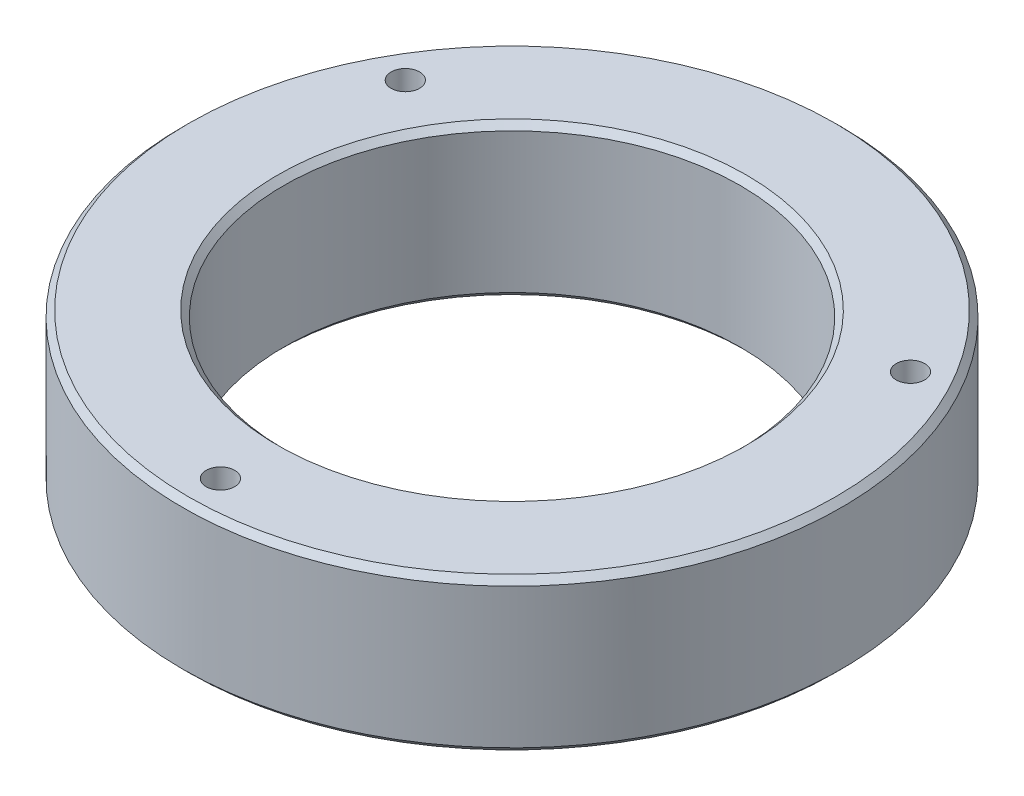
ISO-10303-21;
HEADER;
FILE_DESCRIPTION(('STEP AP214'),'2;1');
FILE_NAME('part.step','',(''),(''),'','','');
FILE_SCHEMA(('AUTOMOTIVE_DESIGN { 1 0 10303 214 1 1 1 1 }'));
ENDSEC;
DATA;
#1=APPLICATION_CONTEXT('core data for automotive mechanical design processes');
#2=APPLICATION_PROTOCOL_DEFINITION('international standard','automotive_design',2000,#1);
#3=PRODUCT_CONTEXT('',#1,'mechanical');
#4=PRODUCT('Part','Part','',(#3));
#5=PRODUCT_RELATED_PRODUCT_CATEGORY('part','',(#4));
#6=PRODUCT_DEFINITION_FORMATION('','',#4);
#7=PRODUCT_DEFINITION_CONTEXT('part definition',#1,'design');
#8=PRODUCT_DEFINITION('design','',#6,#7);
#9=PRODUCT_DEFINITION_SHAPE('','',#8);
#10=(LENGTH_UNIT() NAMED_UNIT(*) SI_UNIT(.MILLI.,.METRE.));
#11=(NAMED_UNIT(*) PLANE_ANGLE_UNIT() SI_UNIT($,.RADIAN.));
#12=(NAMED_UNIT(*) SI_UNIT($,.STERADIAN.) SOLID_ANGLE_UNIT());
#13=UNCERTAINTY_MEASURE_WITH_UNIT(LENGTH_MEASURE(1.E-05),#10,'distance_accuracy_value','');
#14=(GEOMETRIC_REPRESENTATION_CONTEXT(3) GLOBAL_UNCERTAINTY_ASSIGNED_CONTEXT((#13)) GLOBAL_UNIT_ASSIGNED_CONTEXT((#10,
#11,#12)) REPRESENTATION_CONTEXT('',''));
#15=CARTESIAN_POINT('',(0.,0.,0.));
#16=DIRECTION('',(0.,0.,1.));
#17=DIRECTION('',(1.,0.,0.));
#18=AXIS2_PLACEMENT_3D('',#15,#16,#17);
#19=CARTESIAN_POINT('',(-57.15,-19.05,0.));
#20=DIRECTION('',(0.,1.,0.));
#21=DIRECTION('',(0.,0.,1.));
#22=AXIS2_PLACEMENT_3D('',#19,#20,#21);
#23=PLANE('',#22);
#24=CARTESIAN_POINT('',(0.,-19.05,0.));
#25=DIRECTION('',(0.,1.,0.));
#26=DIRECTION('',(0.,0.,1.));
#27=AXIS2_PLACEMENT_3D('',#24,#25,#26);
#28=CIRCLE('',#27,58.674);
#29=CARTESIAN_POINT('',(0.,-19.05,-58.674));
#30=VERTEX_POINT('',#29);
#31=EDGE_CURVE('E55',#30,#30,#28,.T.);
#32=ORIENTED_EDGE('',*,*,#31,.T.);
#33=EDGE_LOOP('',(#32));
#34=FACE_BOUND('',#33,.T.);
#35=CARTESIAN_POINT('',(0.,-19.05,0.));
#36=DIRECTION('',(0.,1.,0.));
#37=DIRECTION('',(0.,0.,1.));
#38=AXIS2_PLACEMENT_3D('',#35,#36,#37);
#39=CIRCLE('',#38,81.0006);
#40=CARTESIAN_POINT('',(0.,-19.05,81.0006));
#41=VERTEX_POINT('',#40);
#42=EDGE_CURVE('E59',#41,#41,#39,.F.);
#43=ORIENTED_EDGE('',*,*,#42,.T.);
#44=EDGE_LOOP('',(#43));
#45=FACE_BOUND('',#44,.T.);
#46=CARTESIAN_POINT('',(-69.85,-19.05,0.));
#47=DIRECTION('',(0.,1.,0.));
#48=DIRECTION('',(0.,0.,1.));
#49=AXIS2_PLACEMENT_3D('',#46,#47,#48);
#50=CIRCLE('',#49,3.96874999999999);
#51=CARTESIAN_POINT('',(-69.85,-19.05,3.96874999999999));
#52=VERTEX_POINT('',#51);
#53=EDGE_CURVE('E119',#52,#52,#50,.T.);
#54=ORIENTED_EDGE('',*,*,#53,.T.);
#55=EDGE_LOOP('',(#54));
#56=FACE_BOUND('',#55,.T.);
#57=CARTESIAN_POINT('',(69.85,-19.05,0.));
#58=DIRECTION('',(0.,1.,0.));
#59=DIRECTION('',(0.,0.,1.));
#60=AXIS2_PLACEMENT_3D('',#57,#58,#59);
#61=CIRCLE('',#60,3.96874999999999);
#62=CARTESIAN_POINT('',(69.85,-19.05,3.96874999999999));
#63=VERTEX_POINT('',#62);
#64=EDGE_CURVE('E113',#63,#63,#61,.T.);
#65=ORIENTED_EDGE('',*,*,#64,.T.);
#66=EDGE_LOOP('',(#65));
#67=FACE_BOUND('',#66,.T.);
#68=CARTESIAN_POINT('',(-63.246,-19.05,-36.5252));
#69=DIRECTION('',(0.,1.,0.));
#70=DIRECTION('',(0.,0.,1.));
#71=AXIS2_PLACEMENT_3D('',#68,#69,#70);
#72=CIRCLE('',#71,5.5626);
#73=CARTESIAN_POINT('',(-63.246,-19.05,-30.9626));
#74=VERTEX_POINT('',#73);
#75=EDGE_CURVE('E107',#74,#74,#72,.T.);
#76=ORIENTED_EDGE('',*,*,#75,.T.);
#77=EDGE_LOOP('',(#76));
#78=FACE_BOUND('',#77,.T.);
#79=CARTESIAN_POINT('',(63.246,-19.05,-36.5252));
#80=DIRECTION('',(0.,1.,0.));
#81=DIRECTION('',(0.,0.,1.));
#82=AXIS2_PLACEMENT_3D('',#79,#80,#81);
#83=CIRCLE('',#82,5.5626);
#84=CARTESIAN_POINT('',(63.246,-19.05,-30.9626));
#85=VERTEX_POINT('',#84);
#86=EDGE_CURVE('E100',#85,#85,#83,.T.);
#87=ORIENTED_EDGE('',*,*,#86,.T.);
#88=EDGE_LOOP('',(#87));
#89=FACE_BOUND('',#88,.T.);
#90=CARTESIAN_POINT('',(0.,-19.05,73.025));
#91=DIRECTION('',(0.,1.,0.));
#92=DIRECTION('',(0.,0.,1.));
#93=AXIS2_PLACEMENT_3D('',#90,#91,#92);
#94=CIRCLE('',#93,5.5626);
#95=CARTESIAN_POINT('',(0.,-19.05,78.5876));
#96=VERTEX_POINT('',#95);
#97=EDGE_CURVE('E93',#96,#96,#94,.T.);
#98=ORIENTED_EDGE('',*,*,#97,.T.);
#99=EDGE_LOOP('',(#98));
#100=FACE_BOUND('',#99,.T.);
#101=ADVANCED_FACE('F43',(#34,#45,#56,#67,#78,#89,#100),#23,.F.);
#102=CARTESIAN_POINT('',(0.,-44.45,0.));
#103=DIRECTION('',(0.,-1.,0.));
#104=DIRECTION('',(0.,0.,-1.));
#105=AXIS2_PLACEMENT_3D('',#102,#103,#104);
#106=CYLINDRICAL_SURFACE('',#105,82.5246);
#107=CARTESIAN_POINT('',(0.,17.526,0.));
#108=DIRECTION('',(0.,-1.,0.));
#109=DIRECTION('',(0.,0.,-1.));
#110=AXIS2_PLACEMENT_3D('',#107,#108,#109);
#111=CIRCLE('',#110,82.5246);
#112=CARTESIAN_POINT('',(0.,17.526,-82.5246));
#113=VERTEX_POINT('',#112);
#114=EDGE_CURVE('E10',#113,#113,#111,.T.);
#115=ORIENTED_EDGE('',*,*,#114,.T.);
#116=EDGE_LOOP('',(#115));
#117=FACE_BOUND('',#116,.T.);
#118=CARTESIAN_POINT('',(0.,-17.526,0.));
#119=DIRECTION('',(0.,1.,0.));
#120=DIRECTION('',(0.,0.,1.));
#121=AXIS2_PLACEMENT_3D('',#118,#119,#120);
#122=CIRCLE('',#121,82.5246);
#123=CARTESIAN_POINT('',(0.,-17.526,82.5246));
#124=VERTEX_POINT('',#123);
#125=EDGE_CURVE('E51',#124,#124,#122,.T.);
#126=ORIENTED_EDGE('',*,*,#125,.T.);
#127=EDGE_LOOP('',(#126));
#128=FACE_BOUND('',#127,.T.);
#129=ADVANCED_FACE('F142',(#117,#128),#106,.T.);
#130=CARTESIAN_POINT('',(-82.5246,19.05,0.));
#131=DIRECTION('',(0.,-1.,0.));
#132=DIRECTION('',(0.,0.,-1.));
#133=AXIS2_PLACEMENT_3D('',#130,#131,#132);
#134=PLANE('',#133);
#135=CARTESIAN_POINT('',(0.,19.05,0.));
#136=DIRECTION('',(0.,-1.,0.));
#137=DIRECTION('',(0.,0.,-1.));
#138=AXIS2_PLACEMENT_3D('',#135,#136,#137);
#139=CIRCLE('',#138,58.674);
#140=CARTESIAN_POINT('',(0.,19.05,-58.674));
#141=VERTEX_POINT('',#140);
#142=EDGE_CURVE('E70',#141,#141,#139,.T.);
#143=ORIENTED_EDGE('',*,*,#142,.T.);
#144=EDGE_LOOP('',(#143));
#145=FACE_BOUND('',#144,.T.);
#146=CARTESIAN_POINT('',(0.,19.05,0.));
#147=DIRECTION('',(0.,-1.,0.));
#148=DIRECTION('',(0.,0.,-1.));
#149=AXIS2_PLACEMENT_3D('',#146,#147,#148);
#150=CIRCLE('',#149,81.0006);
#151=CARTESIAN_POINT('',(0.,19.05,-81.0006));
#152=VERTEX_POINT('',#151);
#153=EDGE_CURVE('E73',#152,#152,#150,.F.);
#154=ORIENTED_EDGE('',*,*,#153,.T.);
#155=EDGE_LOOP('',(#154));
#156=FACE_BOUND('',#155,.T.);
#157=CARTESIAN_POINT('',(-63.246,19.05,-36.5252));
#158=DIRECTION('',(0.,1.,0.));
#159=DIRECTION('',(0.,0.,1.));
#160=AXIS2_PLACEMENT_3D('',#157,#158,#159);
#161=CIRCLE('',#160,3.56869999999999);
#162=CARTESIAN_POINT('',(-63.246,19.05,-40.0939));
#163=VERTEX_POINT('',#162);
#164=EDGE_CURVE('E80',#163,#163,#161,.T.);
#165=ORIENTED_EDGE('',*,*,#164,.F.);
#166=EDGE_LOOP('',(#165));
#167=FACE_BOUND('',#166,.T.);
#168=CARTESIAN_POINT('',(63.246,19.05,-36.5252));
#169=DIRECTION('',(0.,1.,0.));
#170=DIRECTION('',(0.,0.,1.));
#171=AXIS2_PLACEMENT_3D('',#168,#169,#170);
#172=CIRCLE('',#171,3.5687);
#173=CARTESIAN_POINT('',(63.246,19.05,-40.0939));
#174=VERTEX_POINT('',#173);
#175=EDGE_CURVE('E85',#174,#174,#172,.T.);
#176=ORIENTED_EDGE('',*,*,#175,.F.);
#177=EDGE_LOOP('',(#176));
#178=FACE_BOUND('',#177,.T.);
#179=CARTESIAN_POINT('',(0.,19.05,73.025));
#180=DIRECTION('',(0.,1.,0.));
#181=DIRECTION('',(0.,0.,1.));
#182=AXIS2_PLACEMENT_3D('',#179,#180,#181);
#183=CIRCLE('',#182,3.5687);
#184=CARTESIAN_POINT('',(0.,19.05,69.4563));
#185=VERTEX_POINT('',#184);
#186=EDGE_CURVE('E76',#185,#185,#183,.T.);
#187=ORIENTED_EDGE('',*,*,#186,.F.);
#188=EDGE_LOOP('',(#187));
#189=FACE_BOUND('',#188,.T.);
#190=ADVANCED_FACE('F148',(#145,#156,#167,#178,#189),#134,.F.);
#191=CARTESIAN_POINT('',(0.,-44.45,0.));
#192=DIRECTION('',(0.,-1.,0.));
#193=DIRECTION('',(0.,0.,-1.));
#194=AXIS2_PLACEMENT_3D('',#191,#192,#193);
#195=CYLINDRICAL_SURFACE('',#194,57.15);
#196=CARTESIAN_POINT('',(0.,17.526,0.));
#197=DIRECTION('',(0.,-1.,0.));
#198=DIRECTION('',(0.,0.,-1.));
#199=AXIS2_PLACEMENT_3D('',#196,#197,#198);
#200=CIRCLE('',#199,57.15);
#201=CARTESIAN_POINT('',(0.,17.526,-57.15));
#202=VERTEX_POINT('',#201);
#203=EDGE_CURVE('E64',#202,#202,#200,.F.);
#204=CARTESIAN_POINT('',(0.,-17.526,0.));
#205=DIRECTION('',(0.,1.,0.));
#206=DIRECTION('',(0.,0.,1.));
#207=AXIS2_PLACEMENT_3D('',#204,#205,#206);
#208=CIRCLE('',#207,57.15);
#209=CARTESIAN_POINT('',(0.,-17.526,-57.15));
#210=VERTEX_POINT('',#209);
#211=EDGE_CURVE('E67',#210,#210,#208,.F.);
#212=CARTESIAN_POINT('',(0.,17.526,-57.15));
#213=CARTESIAN_POINT('',(0.,17.160875,-57.15));
#214=CARTESIAN_POINT('',(0.,16.79575,-57.15));
#215=CARTESIAN_POINT('',(0.,16.0655,-57.15));
#216=CARTESIAN_POINT('',(0.,15.700375,-57.15));
#217=CARTESIAN_POINT('',(0.,14.970125,-57.15));
#218=CARTESIAN_POINT('',(0.,14.605,-57.15));
#219=CARTESIAN_POINT('',(0.,13.87475,-57.15));
#220=CARTESIAN_POINT('',(0.,13.509625,-57.15));
#221=CARTESIAN_POINT('',(0.,12.779375,-57.15));
#222=CARTESIAN_POINT('',(0.,12.41425,-57.15));
#223=CARTESIAN_POINT('',(0.,11.684,-57.15));
#224=CARTESIAN_POINT('',(0.,11.318875,-57.15));
#225=CARTESIAN_POINT('',(0.,10.588625,-57.15));
#226=CARTESIAN_POINT('',(0.,10.2235,-57.15));
#227=CARTESIAN_POINT('',(0.,9.49324999999998,-57.15));
#228=CARTESIAN_POINT('',(0.,9.12812499999998,-57.15));
#229=CARTESIAN_POINT('',(0.,8.39787499999998,-57.15));
#230=CARTESIAN_POINT('',(0.,8.03274999999998,-57.15));
#231=CARTESIAN_POINT('',(0.,7.30249999999998,-57.15));
#232=CARTESIAN_POINT('',(0.,6.93737499999998,-57.15));
#233=CARTESIAN_POINT('',(0.,6.20712499999998,-57.15));
#234=CARTESIAN_POINT('',(0.,5.84199999999998,-57.15));
#235=CARTESIAN_POINT('',(0.,5.11174999999998,-57.15));
#236=CARTESIAN_POINT('',(0.,4.74662499999998,-57.15));
#237=CARTESIAN_POINT('',(0.,4.01637499999998,-57.15));
#238=CARTESIAN_POINT('',(0.,3.65124999999998,-57.15));
#239=CARTESIAN_POINT('',(0.,2.92099999999998,-57.15));
#240=CARTESIAN_POINT('',(0.,2.55587499999998,-57.15));
#241=CARTESIAN_POINT('',(0.,1.82562499999998,-57.15));
#242=CARTESIAN_POINT('',(0.,1.46049999999998,-57.15));
#243=CARTESIAN_POINT('',(0.,0.730249999999976,-57.15));
#244=CARTESIAN_POINT('',(0.,0.365124999999978,-57.15));
#245=CARTESIAN_POINT('',(0.,-0.365125000000019,-57.15));
#246=CARTESIAN_POINT('',(0.,-0.730250000000018,-57.15));
#247=CARTESIAN_POINT('',(0.,-1.46050000000002,-57.15));
#248=CARTESIAN_POINT('',(0.,-1.82562500000002,-57.15));
#249=CARTESIAN_POINT('',(0.,-2.55587500000002,-57.15));
#250=CARTESIAN_POINT('',(0.,-2.92100000000002,-57.15));
#251=CARTESIAN_POINT('',(0.,-3.65125000000002,-57.15));
#252=CARTESIAN_POINT('',(0.,-4.01637500000002,-57.15));
#253=CARTESIAN_POINT('',(0.,-4.74662500000002,-57.15));
#254=CARTESIAN_POINT('',(0.,-5.11175000000002,-57.15));
#255=CARTESIAN_POINT('',(0.,-5.84200000000002,-57.15));
#256=CARTESIAN_POINT('',(0.,-6.20712500000002,-57.15));
#257=CARTESIAN_POINT('',(0.,-6.93737500000002,-57.15));
#258=CARTESIAN_POINT('',(0.,-7.30250000000002,-57.15));
#259=CARTESIAN_POINT('',(0.,-8.03275000000002,-57.15));
#260=CARTESIAN_POINT('',(0.,-8.39787500000002,-57.15));
#261=CARTESIAN_POINT('',(0.,-9.12812500000002,-57.15));
#262=CARTESIAN_POINT('',(0.,-9.49325000000002,-57.15));
#263=CARTESIAN_POINT('',(0.,-10.2235,-57.15));
#264=CARTESIAN_POINT('',(0.,-10.588625,-57.15));
#265=CARTESIAN_POINT('',(0.,-11.318875,-57.15));
#266=CARTESIAN_POINT('',(0.,-11.684,-57.15));
#267=CARTESIAN_POINT('',(0.,-12.41425,-57.15));
#268=CARTESIAN_POINT('',(0.,-12.779375,-57.15));
#269=CARTESIAN_POINT('',(0.,-13.509625,-57.15));
#270=CARTESIAN_POINT('',(0.,-13.87475,-57.15));
#271=CARTESIAN_POINT('',(0.,-14.605,-57.15));
#272=CARTESIAN_POINT('',(0.,-14.970125,-57.15));
#273=CARTESIAN_POINT('',(0.,-15.700375,-57.15));
#274=CARTESIAN_POINT('',(0.,-16.0655,-57.15));
#275=CARTESIAN_POINT('',(0.,-16.79575,-57.15));
#276=CARTESIAN_POINT('',(0.,-17.160875,-57.15));
#277=CARTESIAN_POINT('',(0.,-17.526,-57.15));
#278=B_SPLINE_CURVE_WITH_KNOTS('',3,(#212,#213,#214,#215,#216,#217,#218,#219,#220,#221,#222,
#223,#224,#225,#226,#227,#228,#229,#230,#231,#232,#233,#234,#235,#236,#237,#238,#239,#240,#241,
#242,#243,#244,#245,#246,#247,#248,#249,#250,#251,#252,#253,#254,#255,#256,#257,#258,#259,#260,
#261,#262,#263,#264,#265,#266,#267,#268,#269,#270,#271,#272,#273,#274,#275,#276,#277),
.UNSPECIFIED.,.F.,.F.,(4,2,2,2,2,2,2,2,2,2,2,2,2,2,2,2,2,2,2,2,2,2,2,2,2,2,2,2,2,2,2,2,4),(0.,
1.095375,2.19075,3.286125,4.3815,5.476875,6.57225,7.667625,8.763,9.858375,10.95375,12.049125,
13.1445,14.239875,15.33525,16.430625,17.526,18.621375,19.71675,20.812125,21.9075,23.002875,
24.09825,25.193625,26.289,27.384375,28.47975,29.575125,30.6705,31.765875,32.86125,33.956625,
35.052),.UNSPECIFIED.);
#279=EDGE_CURVE('BSEAM176',#202,#210,#278,.T.);
#280=ORIENTED_EDGE('',*,*,#203,.T.);
#281=ORIENTED_EDGE('',*,*,#211,.T.);
#282=ORIENTED_EDGE('',*,*,#279,.T.);
#283=ORIENTED_EDGE('',*,*,#279,.F.);
#284=EDGE_LOOP('',(#280,#282,#281,#283));
#285=FACE_BOUND('',#284,.T.);
#286=ADVANCED_FACE('F176',(#285),#195,.F.);
#287=CARTESIAN_POINT('',(0.,19.05,73.025));
#288=DIRECTION('',(0.,-1.,0.));
#289=DIRECTION('',(0.,0.,-1.));
#290=AXIS2_PLACEMENT_3D('',#287,#288,#289);
#291=CYLINDRICAL_SURFACE('',#290,3.5687);
#292=CARTESIAN_POINT('',(0.,-9.398,73.025));
#293=DIRECTION('',(0.,1.,0.));
#294=DIRECTION('',(0.,0.,1.));
#295=AXIS2_PLACEMENT_3D('',#292,#293,#294);
#296=CIRCLE('',#295,3.5687);
#297=CARTESIAN_POINT('',(0.,-9.398,69.4563));
#298=VERTEX_POINT('',#297);
#299=EDGE_CURVE('E87',#298,#298,#296,.T.);
#300=CARTESIAN_POINT('',(0.,-9.398,69.4563));
#301=CARTESIAN_POINT('',(0.,-9.10166666666667,69.4563));
#302=CARTESIAN_POINT('',(0.,-8.80533333333333,69.4563));
#303=CARTESIAN_POINT('',(0.,-8.21266666666667,69.4563));
#304=CARTESIAN_POINT('',(0.,-7.91633333333333,69.4563));
#305=CARTESIAN_POINT('',(0.,-7.32366666666667,69.4563));
#306=CARTESIAN_POINT('',(0.,-7.02733333333333,69.4563));
#307=CARTESIAN_POINT('',(0.,-6.43466666666667,69.4563));
#308=CARTESIAN_POINT('',(0.,-6.13833333333333,69.4563));
#309=CARTESIAN_POINT('',(0.,-5.54566666666667,69.4563));
#310=CARTESIAN_POINT('',(0.,-5.24933333333333,69.4563));
#311=CARTESIAN_POINT('',(0.,-4.65666666666667,69.4563));
#312=CARTESIAN_POINT('',(0.,-4.36033333333333,69.4563));
#313=CARTESIAN_POINT('',(0.,-3.76766666666667,69.4563));
#314=CARTESIAN_POINT('',(0.,-3.47133333333333,69.4563));
#315=CARTESIAN_POINT('',(0.,-2.87866666666667,69.4563));
#316=CARTESIAN_POINT('',(0.,-2.58233333333333,69.4563));
#317=CARTESIAN_POINT('',(0.,-1.98966666666667,69.4563));
#318=CARTESIAN_POINT('',(0.,-1.69333333333333,69.4563));
#319=CARTESIAN_POINT('',(0.,-1.10066666666667,69.4563));
#320=CARTESIAN_POINT('',(0.,-0.804333333333332,69.4563));
#321=CARTESIAN_POINT('',(0.,-0.211666666666664,69.4563));
#322=CARTESIAN_POINT('',(0.,0.0846666666666693,69.4563));
#323=CARTESIAN_POINT('',(0.,0.677333333333336,69.4563));
#324=CARTESIAN_POINT('',(0.,0.97366666666667,69.4563));
#325=CARTESIAN_POINT('',(0.,1.56633333333334,69.4563));
#326=CARTESIAN_POINT('',(0.,1.86266666666667,69.4563));
#327=CARTESIAN_POINT('',(0.,2.45533333333334,69.4563));
#328=CARTESIAN_POINT('',(0.,2.75166666666667,69.4563));
#329=CARTESIAN_POINT('',(0.,3.34433333333333,69.4563));
#330=CARTESIAN_POINT('',(0.,3.64066666666667,69.4563));
#331=CARTESIAN_POINT('',(0.,4.23333333333333,69.4563));
#332=CARTESIAN_POINT('',(0.,4.52966666666667,69.4563));
#333=CARTESIAN_POINT('',(0.,5.12233333333333,69.4563));
#334=CARTESIAN_POINT('',(0.,5.41866666666667,69.4563));
#335=CARTESIAN_POINT('',(0.,6.01133333333333,69.4563));
#336=CARTESIAN_POINT('',(0.,6.30766666666667,69.4563));
#337=CARTESIAN_POINT('',(0.,6.90033333333333,69.4563));
#338=CARTESIAN_POINT('',(0.,7.19666666666667,69.4563));
#339=CARTESIAN_POINT('',(0.,7.78933333333333,69.4563));
#340=CARTESIAN_POINT('',(0.,8.08566666666667,69.4563));
#341=CARTESIAN_POINT('',(0.,8.67833333333333,69.4563));
#342=CARTESIAN_POINT('',(0.,8.97466666666667,69.4563));
#343=CARTESIAN_POINT('',(0.,9.56733333333333,69.4563));
#344=CARTESIAN_POINT('',(0.,9.86366666666667,69.4563));
#345=CARTESIAN_POINT('',(0.,10.4563333333333,69.4563));
#346=CARTESIAN_POINT('',(0.,10.7526666666667,69.4563));
#347=CARTESIAN_POINT('',(0.,11.3453333333333,69.4563));
#348=CARTESIAN_POINT('',(0.,11.6416666666667,69.4563));
#349=CARTESIAN_POINT('',(0.,12.2343333333333,69.4563));
#350=CARTESIAN_POINT('',(0.,12.5306666666667,69.4563));
#351=CARTESIAN_POINT('',(0.,13.1233333333333,69.4563));
#352=CARTESIAN_POINT('',(0.,13.4196666666667,69.4563));
#353=CARTESIAN_POINT('',(0.,14.0123333333333,69.4563));
#354=CARTESIAN_POINT('',(0.,14.3086666666667,69.4563));
#355=CARTESIAN_POINT('',(0.,14.9013333333333,69.4563));
#356=CARTESIAN_POINT('',(0.,15.1976666666667,69.4563));
#357=CARTESIAN_POINT('',(0.,15.7903333333333,69.4563));
#358=CARTESIAN_POINT('',(0.,16.0866666666667,69.4563));
#359=CARTESIAN_POINT('',(0.,16.6793333333333,69.4563));
#360=CARTESIAN_POINT('',(0.,16.9756666666667,69.4563));
#361=CARTESIAN_POINT('',(0.,17.5683333333333,69.4563));
#362=CARTESIAN_POINT('',(0.,17.8646666666667,69.4563));
#363=CARTESIAN_POINT('',(0.,18.4573333333333,69.4563));
#364=CARTESIAN_POINT('',(0.,18.7536666666667,69.4563));
#365=CARTESIAN_POINT('',(0.,19.05,69.4563));
#366=B_SPLINE_CURVE_WITH_KNOTS('',3,(#300,#301,#302,#303,#304,#305,#306,#307,#308,#309,#310,
#311,#312,#313,#314,#315,#316,#317,#318,#319,#320,#321,#322,#323,#324,#325,#326,#327,#328,#329,
#330,#331,#332,#333,#334,#335,#336,#337,#338,#339,#340,#341,#342,#343,#344,#345,#346,#347,#348,
#349,#350,#351,#352,#353,#354,#355,#356,#357,#358,#359,#360,#361,#362,#363,#364,#365),
.UNSPECIFIED.,.F.,.F.,(4,2,2,2,2,2,2,2,2,2,2,2,2,2,2,2,2,2,2,2,2,2,2,2,2,2,2,2,2,2,2,2,4),(0.,
0.889000000000001,1.778,2.667,3.556,4.445,5.334,6.223,7.112,8.001,8.89,9.779,10.668,11.557,
12.446,13.335,14.224,15.113,16.002,16.891,17.78,18.669,19.558,20.447,21.336,22.225,23.114,
24.003,24.892,25.781,26.67,27.559,28.448),.UNSPECIFIED.);
#367=EDGE_CURVE('BSEAM184',#298,#185,#366,.T.);
#368=ORIENTED_EDGE('',*,*,#299,.F.);
#369=ORIENTED_EDGE('',*,*,#186,.T.);
#370=ORIENTED_EDGE('',*,*,#367,.T.);
#371=ORIENTED_EDGE('',*,*,#367,.F.);
#372=EDGE_LOOP('',(#368,#370,#369,#371));
#373=FACE_BOUND('',#372,.T.);
#374=ADVANCED_FACE('F184',(#373),#291,.F.);
#375=CARTESIAN_POINT('',(0.,-9.398,73.025));
#376=DIRECTION('',(0.,-1.,0.));
#377=DIRECTION('',(0.,0.,-1.));
#378=AXIS2_PLACEMENT_3D('',#375,#376,#377);
#379=CYLINDRICAL_SURFACE('',#378,5.5626);
#380=CARTESIAN_POINT('',(0.,-9.398,73.025));
#381=DIRECTION('',(0.,1.,0.));
#382=DIRECTION('',(0.,0.,1.));
#383=AXIS2_PLACEMENT_3D('',#380,#381,#382);
#384=CIRCLE('',#383,5.5626);
#385=CARTESIAN_POINT('',(0.,-9.398,78.5876));
#386=VERTEX_POINT('',#385);
#387=EDGE_CURVE('E90',#386,#386,#384,.T.);
#388=ORIENTED_EDGE('',*,*,#387,.T.);
#389=EDGE_LOOP('',(#388));
#390=FACE_BOUND('',#389,.T.);
#391=ORIENTED_EDGE('',*,*,#97,.F.);
#392=EDGE_LOOP('',(#391));
#393=FACE_BOUND('',#392,.T.);
#394=ADVANCED_FACE('F186',(#390,#393),#379,.F.);
#395=CARTESIAN_POINT('',(0.,-9.398,73.025));
#396=DIRECTION('',(0.,1.,0.));
#397=DIRECTION('',(0.,0.,1.));
#398=AXIS2_PLACEMENT_3D('',#395,#396,#397);
#399=PLANE('',#398);
#400=ORIENTED_EDGE('',*,*,#299,.T.);
#401=EDGE_LOOP('',(#400));
#402=FACE_BOUND('',#401,.T.);
#403=ORIENTED_EDGE('',*,*,#387,.F.);
#404=EDGE_LOOP('',(#403));
#405=FACE_BOUND('',#404,.T.);
#406=ADVANCED_FACE('F192',(#402,#405),#399,.F.);
#407=CARTESIAN_POINT('',(63.246,19.05,-36.5252));
#408=DIRECTION('',(0.,-1.,0.));
#409=DIRECTION('',(0.,0.,-1.));
#410=AXIS2_PLACEMENT_3D('',#407,#408,#409);
#411=CYLINDRICAL_SURFACE('',#410,3.5687);
#412=CARTESIAN_POINT('',(63.246,-9.398,-36.5252));
#413=DIRECTION('',(0.,1.,0.));
#414=DIRECTION('',(0.,0.,1.));
#415=AXIS2_PLACEMENT_3D('',#412,#413,#414);
#416=CIRCLE('',#415,3.5687);
#417=CARTESIAN_POINT('',(63.246,-9.398,-40.0939));
#418=VERTEX_POINT('',#417);
#419=EDGE_CURVE('E82',#418,#418,#416,.T.);
#420=CARTESIAN_POINT('',(63.246,-9.398,-40.0939));
#421=CARTESIAN_POINT('',(63.246,-9.10166666666667,-40.0939));
#422=CARTESIAN_POINT('',(63.246,-8.80533333333333,-40.0939));
#423=CARTESIAN_POINT('',(63.246,-8.21266666666667,-40.0939));
#424=CARTESIAN_POINT('',(63.246,-7.91633333333333,-40.0939));
#425=CARTESIAN_POINT('',(63.246,-7.32366666666667,-40.0939));
#426=CARTESIAN_POINT('',(63.246,-7.02733333333333,-40.0939));
#427=CARTESIAN_POINT('',(63.246,-6.43466666666667,-40.0939));
#428=CARTESIAN_POINT('',(63.246,-6.13833333333333,-40.0939));
#429=CARTESIAN_POINT('',(63.246,-5.54566666666667,-40.0939));
#430=CARTESIAN_POINT('',(63.246,-5.24933333333333,-40.0939));
#431=CARTESIAN_POINT('',(63.246,-4.65666666666667,-40.0939));
#432=CARTESIAN_POINT('',(63.246,-4.36033333333333,-40.0939));
#433=CARTESIAN_POINT('',(63.246,-3.76766666666667,-40.0939));
#434=CARTESIAN_POINT('',(63.246,-3.47133333333333,-40.0939));
#435=CARTESIAN_POINT('',(63.246,-2.87866666666667,-40.0939));
#436=CARTESIAN_POINT('',(63.246,-2.58233333333333,-40.0939));
#437=CARTESIAN_POINT('',(63.246,-1.98966666666667,-40.0939));
#438=CARTESIAN_POINT('',(63.246,-1.69333333333333,-40.0939));
#439=CARTESIAN_POINT('',(63.246,-1.10066666666667,-40.0939));
#440=CARTESIAN_POINT('',(63.246,-0.804333333333332,-40.0939));
#441=CARTESIAN_POINT('',(63.246,-0.211666666666664,-40.0939));
#442=CARTESIAN_POINT('',(63.246,0.0846666666666693,-40.0939));
#443=CARTESIAN_POINT('',(63.246,0.677333333333336,-40.0939));
#444=CARTESIAN_POINT('',(63.246,0.97366666666667,-40.0939));
#445=CARTESIAN_POINT('',(63.246,1.56633333333334,-40.0939));
#446=CARTESIAN_POINT('',(63.246,1.86266666666667,-40.0939));
#447=CARTESIAN_POINT('',(63.246,2.45533333333334,-40.0939));
#448=CARTESIAN_POINT('',(63.246,2.75166666666667,-40.0939));
#449=CARTESIAN_POINT('',(63.246,3.34433333333333,-40.0939));
#450=CARTESIAN_POINT('',(63.246,3.64066666666667,-40.0939));
#451=CARTESIAN_POINT('',(63.246,4.23333333333333,-40.0939));
#452=CARTESIAN_POINT('',(63.246,4.52966666666667,-40.0939));
#453=CARTESIAN_POINT('',(63.246,5.12233333333333,-40.0939));
#454=CARTESIAN_POINT('',(63.246,5.41866666666667,-40.0939));
#455=CARTESIAN_POINT('',(63.246,6.01133333333333,-40.0939));
#456=CARTESIAN_POINT('',(63.246,6.30766666666667,-40.0939));
#457=CARTESIAN_POINT('',(63.246,6.90033333333333,-40.0939));
#458=CARTESIAN_POINT('',(63.246,7.19666666666667,-40.0939));
#459=CARTESIAN_POINT('',(63.246,7.78933333333333,-40.0939));
#460=CARTESIAN_POINT('',(63.246,8.08566666666667,-40.0939));
#461=CARTESIAN_POINT('',(63.246,8.67833333333333,-40.0939));
#462=CARTESIAN_POINT('',(63.246,8.97466666666667,-40.0939));
#463=CARTESIAN_POINT('',(63.246,9.56733333333333,-40.0939));
#464=CARTESIAN_POINT('',(63.246,9.86366666666667,-40.0939));
#465=CARTESIAN_POINT('',(63.246,10.4563333333333,-40.0939));
#466=CARTESIAN_POINT('',(63.246,10.7526666666667,-40.0939));
#467=CARTESIAN_POINT('',(63.246,11.3453333333333,-40.0939));
#468=CARTESIAN_POINT('',(63.246,11.6416666666667,-40.0939));
#469=CARTESIAN_POINT('',(63.246,12.2343333333333,-40.0939));
#470=CARTESIAN_POINT('',(63.246,12.5306666666667,-40.0939));
#471=CARTESIAN_POINT('',(63.246,13.1233333333333,-40.0939));
#472=CARTESIAN_POINT('',(63.246,13.4196666666667,-40.0939));
#473=CARTESIAN_POINT('',(63.246,14.0123333333333,-40.0939));
#474=CARTESIAN_POINT('',(63.246,14.3086666666667,-40.0939));
#475=CARTESIAN_POINT('',(63.246,14.9013333333333,-40.0939));
#476=CARTESIAN_POINT('',(63.246,15.1976666666667,-40.0939));
#477=CARTESIAN_POINT('',(63.246,15.7903333333333,-40.0939));
#478=CARTESIAN_POINT('',(63.246,16.0866666666667,-40.0939));
#479=CARTESIAN_POINT('',(63.246,16.6793333333333,-40.0939));
#480=CARTESIAN_POINT('',(63.246,16.9756666666667,-40.0939));
#481=CARTESIAN_POINT('',(63.246,17.5683333333333,-40.0939));
#482=CARTESIAN_POINT('',(63.246,17.8646666666667,-40.0939));
#483=CARTESIAN_POINT('',(63.246,18.4573333333333,-40.0939));
#484=CARTESIAN_POINT('',(63.246,18.7536666666667,-40.0939));
#485=CARTESIAN_POINT('',(63.246,19.05,-40.0939));
#486=B_SPLINE_CURVE_WITH_KNOTS('',3,(#420,#421,#422,#423,#424,#425,#426,#427,#428,#429,#430,
#431,#432,#433,#434,#435,#436,#437,#438,#439,#440,#441,#442,#443,#444,#445,#446,#447,#448,#449,
#450,#451,#452,#453,#454,#455,#456,#457,#458,#459,#460,#461,#462,#463,#464,#465,#466,#467,#468,
#469,#470,#471,#472,#473,#474,#475,#476,#477,#478,#479,#480,#481,#482,#483,#484,#485),
.UNSPECIFIED.,.F.,.F.,(4,2,2,2,2,2,2,2,2,2,2,2,2,2,2,2,2,2,2,2,2,2,2,2,2,2,2,2,2,2,2,2,4),(0.,
0.889000000000001,1.778,2.667,3.556,4.445,5.334,6.223,7.112,8.001,8.89,9.779,10.668,11.557,
12.446,13.335,14.224,15.113,16.002,16.891,17.78,18.669,19.558,20.447,21.336,22.225,23.114,
24.003,24.892,25.781,26.67,27.559,28.448),.UNSPECIFIED.);
#487=EDGE_CURVE('BSEAM202',#418,#174,#486,.T.);
#488=ORIENTED_EDGE('',*,*,#419,.F.);
#489=ORIENTED_EDGE('',*,*,#175,.T.);
#490=ORIENTED_EDGE('',*,*,#487,.T.);
#491=ORIENTED_EDGE('',*,*,#487,.F.);
#492=EDGE_LOOP('',(#488,#490,#489,#491));
#493=FACE_BOUND('',#492,.T.);
#494=ADVANCED_FACE('F202',(#493),#411,.F.);
#495=CARTESIAN_POINT('',(63.246,-9.398,-36.5252));
#496=DIRECTION('',(0.,-1.,0.));
#497=DIRECTION('',(0.,0.,-1.));
#498=AXIS2_PLACEMENT_3D('',#495,#496,#497);
#499=CYLINDRICAL_SURFACE('',#498,5.5626);
#500=CARTESIAN_POINT('',(63.246,-9.398,-36.5252));
#501=DIRECTION('',(0.,1.,0.));
#502=DIRECTION('',(0.,0.,1.));
#503=AXIS2_PLACEMENT_3D('',#500,#501,#502);
#504=CIRCLE('',#503,5.5626);
#505=CARTESIAN_POINT('',(63.246,-9.398,-30.9626));
#506=VERTEX_POINT('',#505);
#507=EDGE_CURVE('E86',#506,#506,#504,.T.);
#508=ORIENTED_EDGE('',*,*,#507,.T.);
#509=EDGE_LOOP('',(#508));
#510=FACE_BOUND('',#509,.T.);
#511=ORIENTED_EDGE('',*,*,#86,.F.);
#512=EDGE_LOOP('',(#511));
#513=FACE_BOUND('',#512,.T.);
#514=ADVANCED_FACE('F206',(#510,#513),#499,.F.);
#515=CARTESIAN_POINT('',(63.246,-9.398,-36.5252));
#516=DIRECTION('',(0.,1.,0.));
#517=DIRECTION('',(0.,0.,1.));
#518=AXIS2_PLACEMENT_3D('',#515,#516,#517);
#519=PLANE('',#518);
#520=ORIENTED_EDGE('',*,*,#419,.T.);
#521=EDGE_LOOP('',(#520));
#522=FACE_BOUND('',#521,.T.);
#523=ORIENTED_EDGE('',*,*,#507,.F.);
#524=EDGE_LOOP('',(#523));
#525=FACE_BOUND('',#524,.T.);
#526=ADVANCED_FACE('F210',(#522,#525),#519,.F.);
#527=CARTESIAN_POINT('',(-63.246,19.05,-36.5252));
#528=DIRECTION('',(0.,-1.,0.));
#529=DIRECTION('',(0.,0.,-1.));
#530=AXIS2_PLACEMENT_3D('',#527,#528,#529);
#531=CYLINDRICAL_SURFACE('',#530,3.56869999999999);
#532=CARTESIAN_POINT('',(-63.246,-9.398,-36.5252));
#533=DIRECTION('',(0.,1.,0.));
#534=DIRECTION('',(0.,0.,1.));
#535=AXIS2_PLACEMENT_3D('',#532,#533,#534);
#536=CIRCLE('',#535,3.56869999999999);
#537=CARTESIAN_POINT('',(-63.246,-9.398,-40.0939));
#538=VERTEX_POINT('',#537);
#539=EDGE_CURVE('E77',#538,#538,#536,.T.);
#540=CARTESIAN_POINT('',(-63.246,-9.398,-40.0939));
#541=CARTESIAN_POINT('',(-63.246,-9.10166666666667,-40.0939));
#542=CARTESIAN_POINT('',(-63.246,-8.80533333333333,-40.0939));
#543=CARTESIAN_POINT('',(-63.246,-8.21266666666667,-40.0939));
#544=CARTESIAN_POINT('',(-63.246,-7.91633333333333,-40.0939));
#545=CARTESIAN_POINT('',(-63.246,-7.32366666666667,-40.0939));
#546=CARTESIAN_POINT('',(-63.246,-7.02733333333333,-40.0939));
#547=CARTESIAN_POINT('',(-63.246,-6.43466666666667,-40.0939));
#548=CARTESIAN_POINT('',(-63.246,-6.13833333333333,-40.0939));
#549=CARTESIAN_POINT('',(-63.246,-5.54566666666667,-40.0939));
#550=CARTESIAN_POINT('',(-63.246,-5.24933333333333,-40.0939));
#551=CARTESIAN_POINT('',(-63.246,-4.65666666666667,-40.0939));
#552=CARTESIAN_POINT('',(-63.246,-4.36033333333333,-40.0939));
#553=CARTESIAN_POINT('',(-63.246,-3.76766666666667,-40.0939));
#554=CARTESIAN_POINT('',(-63.246,-3.47133333333333,-40.0939));
#555=CARTESIAN_POINT('',(-63.246,-2.87866666666667,-40.0939));
#556=CARTESIAN_POINT('',(-63.246,-2.58233333333333,-40.0939));
#557=CARTESIAN_POINT('',(-63.246,-1.98966666666667,-40.0939));
#558=CARTESIAN_POINT('',(-63.246,-1.69333333333333,-40.0939));
#559=CARTESIAN_POINT('',(-63.246,-1.10066666666667,-40.0939));
#560=CARTESIAN_POINT('',(-63.246,-0.804333333333332,-40.0939));
#561=CARTESIAN_POINT('',(-63.246,-0.211666666666664,-40.0939));
#562=CARTESIAN_POINT('',(-63.246,0.0846666666666693,-40.0939));
#563=CARTESIAN_POINT('',(-63.246,0.677333333333336,-40.0939));
#564=CARTESIAN_POINT('',(-63.246,0.97366666666667,-40.0939));
#565=CARTESIAN_POINT('',(-63.246,1.56633333333334,-40.0939));
#566=CARTESIAN_POINT('',(-63.246,1.86266666666667,-40.0939));
#567=CARTESIAN_POINT('',(-63.246,2.45533333333334,-40.0939));
#568=CARTESIAN_POINT('',(-63.246,2.75166666666667,-40.0939));
#569=CARTESIAN_POINT('',(-63.246,3.34433333333333,-40.0939));
#570=CARTESIAN_POINT('',(-63.246,3.64066666666667,-40.0939));
#571=CARTESIAN_POINT('',(-63.246,4.23333333333333,-40.0939));
#572=CARTESIAN_POINT('',(-63.246,4.52966666666667,-40.0939));
#573=CARTESIAN_POINT('',(-63.246,5.12233333333333,-40.0939));
#574=CARTESIAN_POINT('',(-63.246,5.41866666666667,-40.0939));
#575=CARTESIAN_POINT('',(-63.246,6.01133333333333,-40.0939));
#576=CARTESIAN_POINT('',(-63.246,6.30766666666667,-40.0939));
#577=CARTESIAN_POINT('',(-63.246,6.90033333333333,-40.0939));
#578=CARTESIAN_POINT('',(-63.246,7.19666666666667,-40.0939));
#579=CARTESIAN_POINT('',(-63.246,7.78933333333333,-40.0939));
#580=CARTESIAN_POINT('',(-63.246,8.08566666666667,-40.0939));
#581=CARTESIAN_POINT('',(-63.246,8.67833333333333,-40.0939));
#582=CARTESIAN_POINT('',(-63.246,8.97466666666667,-40.0939));
#583=CARTESIAN_POINT('',(-63.246,9.56733333333333,-40.0939));
#584=CARTESIAN_POINT('',(-63.246,9.86366666666667,-40.0939));
#585=CARTESIAN_POINT('',(-63.246,10.4563333333333,-40.0939));
#586=CARTESIAN_POINT('',(-63.246,10.7526666666667,-40.0939));
#587=CARTESIAN_POINT('',(-63.246,11.3453333333333,-40.0939));
#588=CARTESIAN_POINT('',(-63.246,11.6416666666667,-40.0939));
#589=CARTESIAN_POINT('',(-63.246,12.2343333333333,-40.0939));
#590=CARTESIAN_POINT('',(-63.246,12.5306666666667,-40.0939));
#591=CARTESIAN_POINT('',(-63.246,13.1233333333333,-40.0939));
#592=CARTESIAN_POINT('',(-63.246,13.4196666666667,-40.0939));
#593=CARTESIAN_POINT('',(-63.246,14.0123333333333,-40.0939));
#594=CARTESIAN_POINT('',(-63.246,14.3086666666667,-40.0939));
#595=CARTESIAN_POINT('',(-63.246,14.9013333333333,-40.0939));
#596=CARTESIAN_POINT('',(-63.246,15.1976666666667,-40.0939));
#597=CARTESIAN_POINT('',(-63.246,15.7903333333333,-40.0939));
#598=CARTESIAN_POINT('',(-63.246,16.0866666666667,-40.0939));
#599=CARTESIAN_POINT('',(-63.246,16.6793333333333,-40.0939));
#600=CARTESIAN_POINT('',(-63.246,16.9756666666667,-40.0939));
#601=CARTESIAN_POINT('',(-63.246,17.5683333333333,-40.0939));
#602=CARTESIAN_POINT('',(-63.246,17.8646666666667,-40.0939));
#603=CARTESIAN_POINT('',(-63.246,18.4573333333333,-40.0939));
#604=CARTESIAN_POINT('',(-63.246,18.7536666666667,-40.0939));
#605=CARTESIAN_POINT('',(-63.246,19.05,-40.0939));
#606=B_SPLINE_CURVE_WITH_KNOTS('',3,(#540,#541,#542,#543,#544,#545,#546,#547,#548,#549,#550,
#551,#552,#553,#554,#555,#556,#557,#558,#559,#560,#561,#562,#563,#564,#565,#566,#567,#568,#569,
#570,#571,#572,#573,#574,#575,#576,#577,#578,#579,#580,#581,#582,#583,#584,#585,#586,#587,#588,
#589,#590,#591,#592,#593,#594,#595,#596,#597,#598,#599,#600,#601,#602,#603,#604,#605),
.UNSPECIFIED.,.F.,.F.,(4,2,2,2,2,2,2,2,2,2,2,2,2,2,2,2,2,2,2,2,2,2,2,2,2,2,2,2,2,2,2,2,4),(0.,
0.889000000000001,1.778,2.667,3.556,4.445,5.334,6.223,7.112,8.001,8.89,9.779,10.668,11.557,
12.446,13.335,14.224,15.113,16.002,16.891,17.78,18.669,19.558,20.447,21.336,22.225,23.114,
24.003,24.892,25.781,26.67,27.559,28.448),.UNSPECIFIED.);
#607=EDGE_CURVE('BSEAM214',#538,#163,#606,.T.);
#608=ORIENTED_EDGE('',*,*,#539,.F.);
#609=ORIENTED_EDGE('',*,*,#164,.T.);
#610=ORIENTED_EDGE('',*,*,#607,.T.);
#611=ORIENTED_EDGE('',*,*,#607,.F.);
#612=EDGE_LOOP('',(#608,#610,#609,#611));
#613=FACE_BOUND('',#612,.T.);
#614=ADVANCED_FACE('F214',(#613),#531,.F.);
#615=CARTESIAN_POINT('',(-63.246,-9.398,-36.5252));
#616=DIRECTION('',(0.,-1.,0.));
#617=DIRECTION('',(0.,0.,-1.));
#618=AXIS2_PLACEMENT_3D('',#615,#616,#617);
#619=CYLINDRICAL_SURFACE('',#618,5.5626);
#620=CARTESIAN_POINT('',(-63.246,-9.398,-36.5252));
#621=DIRECTION('',(0.,1.,0.));
#622=DIRECTION('',(0.,0.,1.));
#623=AXIS2_PLACEMENT_3D('',#620,#621,#622);
#624=CIRCLE('',#623,5.5626);
#625=CARTESIAN_POINT('',(-63.246,-9.398,-30.9626));
#626=VERTEX_POINT('',#625);
#627=EDGE_CURVE('E81',#626,#626,#624,.T.);
#628=ORIENTED_EDGE('',*,*,#627,.T.);
#629=EDGE_LOOP('',(#628));
#630=FACE_BOUND('',#629,.T.);
#631=ORIENTED_EDGE('',*,*,#75,.F.);
#632=EDGE_LOOP('',(#631));
#633=FACE_BOUND('',#632,.T.);
#634=ADVANCED_FACE('F218',(#630,#633),#619,.F.);
#635=CARTESIAN_POINT('',(-63.246,-9.398,-36.5252));
#636=DIRECTION('',(0.,1.,0.));
#637=DIRECTION('',(0.,0.,1.));
#638=AXIS2_PLACEMENT_3D('',#635,#636,#637);
#639=PLANE('',#638);
#640=ORIENTED_EDGE('',*,*,#539,.T.);
#641=EDGE_LOOP('',(#640));
#642=FACE_BOUND('',#641,.T.);
#643=ORIENTED_EDGE('',*,*,#627,.F.);
#644=EDGE_LOOP('',(#643));
#645=FACE_BOUND('',#644,.T.);
#646=ADVANCED_FACE('F222',(#642,#645),#639,.F.);
#647=CARTESIAN_POINT('',(69.85,6.35,0.));
#648=DIRECTION('',(0.,-1.,0.));
#649=DIRECTION('',(0.,0.,-1.));
#650=AXIS2_PLACEMENT_3D('',#647,#648,#649);
#651=CYLINDRICAL_SURFACE('',#650,3.96874999999999);
#652=CARTESIAN_POINT('',(69.85,6.35,0.));
#653=DIRECTION('',(0.,1.,0.));
#654=DIRECTION('',(0.,0.,1.));
#655=AXIS2_PLACEMENT_3D('',#652,#653,#654);
#656=CIRCLE('',#655,3.96874999999999);
#657=CARTESIAN_POINT('',(69.85,6.35,3.96874999999999));
#658=VERTEX_POINT('',#657);
#659=EDGE_CURVE('E110',#658,#658,#656,.T.);
#660=ORIENTED_EDGE('',*,*,#659,.T.);
#661=EDGE_LOOP('',(#660));
#662=FACE_BOUND('',#661,.T.);
#663=ORIENTED_EDGE('',*,*,#64,.F.);
#664=EDGE_LOOP('',(#663));
#665=FACE_BOUND('',#664,.T.);
#666=ADVANCED_FACE('F226',(#662,#665),#651,.F.);
#667=CARTESIAN_POINT('',(69.85,6.35,0.));
#668=DIRECTION('',(0.,1.,0.));
#669=DIRECTION('',(0.,0.,1.));
#670=AXIS2_PLACEMENT_3D('',#667,#668,#669);
#671=PLANE('',#670);
#672=ORIENTED_EDGE('',*,*,#659,.F.);
#673=EDGE_LOOP('',(#672));
#674=FACE_BOUND('',#673,.T.);
#675=ADVANCED_FACE('F140',(#674),#671,.F.);
#676=CARTESIAN_POINT('',(-69.85,6.35,0.));
#677=DIRECTION('',(0.,-1.,0.));
#678=DIRECTION('',(0.,0.,-1.));
#679=AXIS2_PLACEMENT_3D('',#676,#677,#678);
#680=CYLINDRICAL_SURFACE('',#679,3.96874999999999);
#681=CARTESIAN_POINT('',(-69.85,6.35,0.));
#682=DIRECTION('',(0.,1.,0.));
#683=DIRECTION('',(0.,0.,1.));
#684=AXIS2_PLACEMENT_3D('',#681,#682,#683);
#685=CIRCLE('',#684,3.96874999999999);
#686=CARTESIAN_POINT('',(-69.85,6.35,3.96874999999999));
#687=VERTEX_POINT('',#686);
#688=EDGE_CURVE('E116',#687,#687,#685,.T.);
#689=ORIENTED_EDGE('',*,*,#688,.T.);
#690=EDGE_LOOP('',(#689));
#691=FACE_BOUND('',#690,.T.);
#692=ORIENTED_EDGE('',*,*,#53,.F.);
#693=EDGE_LOOP('',(#692));
#694=FACE_BOUND('',#693,.T.);
#695=ADVANCED_FACE('F125',(#691,#694),#680,.F.);
#696=CARTESIAN_POINT('',(-69.85,6.35,0.));
#697=DIRECTION('',(0.,1.,0.));
#698=DIRECTION('',(0.,0.,1.));
#699=AXIS2_PLACEMENT_3D('',#696,#697,#698);
#700=PLANE('',#699);
#701=ORIENTED_EDGE('',*,*,#688,.F.);
#702=EDGE_LOOP('',(#701));
#703=FACE_BOUND('',#702,.T.);
#704=ADVANCED_FACE('F128',(#703),#700,.F.);
#705=CARTESIAN_POINT('',(0.,19.05,0.));
#706=DIRECTION('',(0.,1.,0.));
#707=DIRECTION('',(0.,0.,1.));
#708=AXIS2_PLACEMENT_3D('',#705,#706,#707);
#709=CONICAL_SURFACE('',#708,58.674,0.785398163397435);
#710=ORIENTED_EDGE('',*,*,#203,.F.);
#711=EDGE_LOOP('',(#710));
#712=FACE_BOUND('',#711,.T.);
#713=ORIENTED_EDGE('',*,*,#142,.F.);
#714=EDGE_LOOP('',(#713));
#715=FACE_BOUND('',#714,.T.);
#716=ADVANCED_FACE('F130',(#712,#715),#709,.F.);
#717=CARTESIAN_POINT('',(0.,-17.526,0.));
#718=DIRECTION('',(0.,-1.,0.));
#719=DIRECTION('',(0.,0.,-1.));
#720=AXIS2_PLACEMENT_3D('',#717,#718,#719);
#721=CONICAL_SURFACE('',#720,57.15,0.785398163397451);
#722=CARTESIAN_POINT('',(0.,-19.05,-58.674));
#723=CARTESIAN_POINT('',(0.,-19.034125,-58.658125));
#724=CARTESIAN_POINT('',(0.,-19.01825,-58.64225));
#725=CARTESIAN_POINT('',(0.,-18.9865,-58.6105));
#726=CARTESIAN_POINT('',(0.,-18.970625,-58.594625));
#727=CARTESIAN_POINT('',(0.,-18.938875,-58.562875));
#728=CARTESIAN_POINT('',(0.,-18.923,-58.547));
#729=CARTESIAN_POINT('',(0.,-18.89125,-58.51525));
#730=CARTESIAN_POINT('',(0.,-18.875375,-58.499375));
#731=CARTESIAN_POINT('',(0.,-18.843625,-58.467625));
#732=CARTESIAN_POINT('',(0.,-18.82775,-58.45175));
#733=CARTESIAN_POINT('',(0.,-18.796,-58.42));
#734=CARTESIAN_POINT('',(0.,-18.780125,-58.404125));
#735=CARTESIAN_POINT('',(0.,-18.748375,-58.372375));
#736=CARTESIAN_POINT('',(0.,-18.7325,-58.3565));
#737=CARTESIAN_POINT('',(0.,-18.70075,-58.32475));
#738=CARTESIAN_POINT('',(0.,-18.684875,-58.308875));
#739=CARTESIAN_POINT('',(0.,-18.653125,-58.277125));
#740=CARTESIAN_POINT('',(0.,-18.63725,-58.26125));
#741=CARTESIAN_POINT('',(0.,-18.6055,-58.2295));
#742=CARTESIAN_POINT('',(0.,-18.589625,-58.213625));
#743=CARTESIAN_POINT('',(0.,-18.557875,-58.181875));
#744=CARTESIAN_POINT('',(0.,-18.542,-58.166));
#745=CARTESIAN_POINT('',(0.,-18.51025,-58.13425));
#746=CARTESIAN_POINT('',(0.,-18.494375,-58.118375));
#747=CARTESIAN_POINT('',(0.,-18.462625,-58.086625));
#748=CARTESIAN_POINT('',(0.,-18.44675,-58.07075));
#749=CARTESIAN_POINT('',(0.,-18.415,-58.039));
#750=CARTESIAN_POINT('',(0.,-18.399125,-58.023125));
#751=CARTESIAN_POINT('',(0.,-18.367375,-57.991375));
#752=CARTESIAN_POINT('',(0.,-18.3515,-57.9755));
#753=CARTESIAN_POINT('',(0.,-18.31975,-57.94375));
#754=CARTESIAN_POINT('',(0.,-18.303875,-57.927875));
#755=CARTESIAN_POINT('',(0.,-18.272125,-57.896125));
#756=CARTESIAN_POINT('',(0.,-18.25625,-57.88025));
#757=CARTESIAN_POINT('',(0.,-18.2245,-57.8485));
#758=CARTESIAN_POINT('',(0.,-18.208625,-57.832625));
#759=CARTESIAN_POINT('',(0.,-18.176875,-57.800875));
#760=CARTESIAN_POINT('',(0.,-18.161,-57.785));
#761=CARTESIAN_POINT('',(0.,-18.12925,-57.75325));
#762=CARTESIAN_POINT('',(0.,-18.113375,-57.737375));
#763=CARTESIAN_POINT('',(0.,-18.081625,-57.705625));
#764=CARTESIAN_POINT('',(0.,-18.06575,-57.68975));
#765=CARTESIAN_POINT('',(0.,-18.034,-57.658));
#766=CARTESIAN_POINT('',(0.,-18.018125,-57.642125));
#767=CARTESIAN_POINT('',(0.,-17.986375,-57.610375));
#768=CARTESIAN_POINT('',(0.,-17.9705,-57.5945));
#769=CARTESIAN_POINT('',(0.,-17.93875,-57.56275));
#770=CARTESIAN_POINT('',(0.,-17.922875,-57.546875));
#771=CARTESIAN_POINT('',(0.,-17.891125,-57.515125));
#772=CARTESIAN_POINT('',(0.,-17.87525,-57.49925));
#773=CARTESIAN_POINT('',(0.,-17.8435,-57.4675));
#774=CARTESIAN_POINT('',(0.,-17.827625,-57.451625));
#775=CARTESIAN_POINT('',(0.,-17.795875,-57.419875));
#776=CARTESIAN_POINT('',(0.,-17.78,-57.404));
#777=CARTESIAN_POINT('',(0.,-17.74825,-57.37225));
#778=CARTESIAN_POINT('',(0.,-17.732375,-57.356375));
#779=CARTESIAN_POINT('',(0.,-17.700625,-57.324625));
#780=CARTESIAN_POINT('',(0.,-17.68475,-57.30875));
#781=CARTESIAN_POINT('',(0.,-17.653,-57.277));
#782=CARTESIAN_POINT('',(0.,-17.637125,-57.261125));
#783=CARTESIAN_POINT('',(0.,-17.605375,-57.229375));
#784=CARTESIAN_POINT('',(0.,-17.5895,-57.2135));
#785=CARTESIAN_POINT('',(0.,-17.55775,-57.18175));
#786=CARTESIAN_POINT('',(0.,-17.541875,-57.165875));
#787=CARTESIAN_POINT('',(0.,-17.526,-57.15));
#788=B_SPLINE_CURVE_WITH_KNOTS('',3,(#722,#723,#724,#725,#726,#727,#728,#729,#730,#731,#732,
#733,#734,#735,#736,#737,#738,#739,#740,#741,#742,#743,#744,#745,#746,#747,#748,#749,#750,#751,
#752,#753,#754,#755,#756,#757,#758,#759,#760,#761,#762,#763,#764,#765,#766,#767,#768,#769,#770,
#771,#772,#773,#774,#775,#776,#777,#778,#779,#780,#781,#782,#783,#784,#785,#786,#787),
.UNSPECIFIED.,.F.,.F.,(4,2,2,2,2,2,2,2,2,2,2,2,2,2,2,2,2,2,2,2,2,2,2,2,2,2,2,2,2,2,2,2,4),(0.,
0.0673519209080149,0.134703841816037,0.202055762724052,0.269407683632072,0.336759604540087,
0.404111525448106,0.471463446356126,0.538815367264141,0.606167288172161,0.673519209080176,
0.740871129988195,0.80822305089621,0.87557497180423,0.94292689271225,1.01027881362026,
1.07763073452828,1.1449826554363,1.21233457634432,1.27968649725234,1.34703841816036,
1.41439033906838,1.48174225997639,1.54909418088441,1.61644610179242,1.68379802270044,
1.75114994360846,1.81850186451648,1.88585378542449,1.95320570633251,2.02055762724053,
2.08790954814855,2.15526146905657),.UNSPECIFIED.);
#789=EDGE_CURVE('BSEAM137',#30,#210,#788,.T.);
#790=ORIENTED_EDGE('',*,*,#31,.F.);
#791=ORIENTED_EDGE('',*,*,#211,.F.);
#792=ORIENTED_EDGE('',*,*,#789,.T.);
#793=ORIENTED_EDGE('',*,*,#789,.F.);
#794=EDGE_LOOP('',(#790,#792,#791,#793));
#795=FACE_BOUND('',#794,.T.);
#796=ADVANCED_FACE('F137',(#795),#721,.F.);
#797=CARTESIAN_POINT('',(0.,17.526,0.));
#798=DIRECTION('',(0.,-1.,0.));
#799=DIRECTION('',(0.,0.,-1.));
#800=AXIS2_PLACEMENT_3D('',#797,#798,#799);
#801=CONICAL_SURFACE('',#800,82.5246,0.785398163397451);
#802=ORIENTED_EDGE('',*,*,#153,.F.);
#803=EDGE_LOOP('',(#802));
#804=FACE_BOUND('',#803,.T.);
#805=ORIENTED_EDGE('',*,*,#114,.F.);
#806=EDGE_LOOP('',(#805));
#807=FACE_BOUND('',#806,.T.);
#808=ADVANCED_FACE('F161',(#804,#807),#801,.T.);
#809=CARTESIAN_POINT('',(0.,-19.05,0.));
#810=DIRECTION('',(0.,1.,0.));
#811=DIRECTION('',(0.,0.,1.));
#812=AXIS2_PLACEMENT_3D('',#809,#810,#811);
#813=CONICAL_SURFACE('',#812,81.0006,0.785398163397448);
#814=ORIENTED_EDGE('',*,*,#125,.F.);
#815=EDGE_LOOP('',(#814));
#816=FACE_BOUND('',#815,.T.);
#817=ORIENTED_EDGE('',*,*,#42,.F.);
#818=EDGE_LOOP('',(#817));
#819=FACE_BOUND('',#818,.T.);
#820=ADVANCED_FACE('F46',(#816,#819),#813,.T.);
#821=CLOSED_SHELL('',(#101,#129,#190,#286,#374,#394,#406,#494,#514,#526,#614,#634,#646,#666,
#675,#695,#704,#716,#796,#808,#820));
#822=MANIFOLD_SOLID_BREP('B2',#821);
#823=ADVANCED_BREP_SHAPE_REPRESENTATION('',(#18,#822),#14);
#824=SHAPE_DEFINITION_REPRESENTATION(#9,#823);
ENDSEC;
END-ISO-10303-21;
